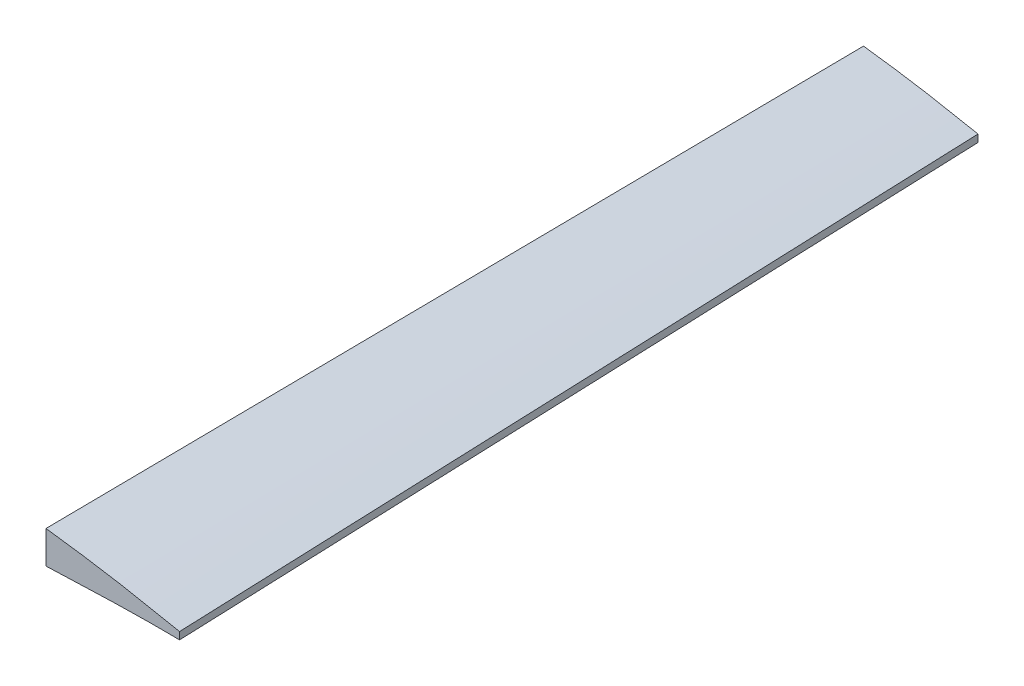
ISO-10303-21;
HEADER;
FILE_DESCRIPTION(('STEP AP214'),'2;1');
FILE_NAME('part.step','',(''),(''),'','','');
FILE_SCHEMA(('AUTOMOTIVE_DESIGN { 1 0 10303 214 1 1 1 1 }'));
ENDSEC;
DATA;
#1=APPLICATION_CONTEXT('core data for automotive mechanical design processes');
#2=APPLICATION_PROTOCOL_DEFINITION('international standard','automotive_design',2000,#1);
#3=PRODUCT_CONTEXT('',#1,'mechanical');
#4=PRODUCT('Part','Part','',(#3));
#5=PRODUCT_RELATED_PRODUCT_CATEGORY('part','',(#4));
#6=PRODUCT_DEFINITION_FORMATION('','',#4);
#7=PRODUCT_DEFINITION_CONTEXT('part definition',#1,'design');
#8=PRODUCT_DEFINITION('design','',#6,#7);
#9=PRODUCT_DEFINITION_SHAPE('','',#8);
#10=(LENGTH_UNIT() NAMED_UNIT(*) SI_UNIT(.MILLI.,.METRE.));
#11=(NAMED_UNIT(*) PLANE_ANGLE_UNIT() SI_UNIT($,.RADIAN.));
#12=(NAMED_UNIT(*) SI_UNIT($,.STERADIAN.) SOLID_ANGLE_UNIT());
#13=UNCERTAINTY_MEASURE_WITH_UNIT(LENGTH_MEASURE(1.E-05),#10,'distance_accuracy_value','');
#14=(GEOMETRIC_REPRESENTATION_CONTEXT(3) GLOBAL_UNCERTAINTY_ASSIGNED_CONTEXT((#13)) GLOBAL_UNIT_ASSIGNED_CONTEXT((#10,
#11,#12)) REPRESENTATION_CONTEXT('',''));
#15=CARTESIAN_POINT('',(0.,0.,0.));
#16=DIRECTION('',(0.,0.,1.));
#17=DIRECTION('',(1.,0.,0.));
#18=AXIS2_PLACEMENT_3D('',#15,#16,#17);
#19=CARTESIAN_POINT('',(206.514876786188,1.05257573191463,-2.3100066304238E-07));
#20=CARTESIAN_POINT('',(216.343251190793,1.1251743413413,256.666666435666));
#21=CARTESIAN_POINT('',(226.171625595397,1.19777295076798,513.333333102333));
#22=CARTESIAN_POINT('',(236.000000000097,1.27037156019246,769.999999768999));
#23=CARTESIAN_POINT('',(202.804481962751,1.09254132410476,-2.3100066304238E-07));
#24=CARTESIAN_POINT('',(212.221409948395,1.18934993939449,256.666666435666));
#25=CARTESIAN_POINT('',(221.638337934039,1.28615855468421,513.333333102333));
#26=CARTESIAN_POINT('',(231.055265919778,1.38296716997175,769.999999768999));
#27=CARTESIAN_POINT('',(195.383134947981,1.07253183731694,-2.30999996908565E-07));
#28=CARTESIAN_POINT('',(203.977460493296,1.19654646463271,256.666666435667));
#29=CARTESIAN_POINT('',(212.570491423613,1.32056286405642,513.333333102333));
#30=CARTESIAN_POINT('',(221.162228710543,1.44462942653907,769.999999768999));
#31=CARTESIAN_POINT('',(184.254157652275,0.86849812408981,-2.31001662243102E-07));
#32=CARTESIAN_POINT('',(191.617059378691,0.994187581201744,256.666666435665));
#33=CARTESIAN_POINT('',(198.973568943558,1.11988578774656,513.333333102332));
#34=CARTESIAN_POINT('',(206.323691143901,1.24583167639904,769.999999768999));
#35=CARTESIAN_POINT('',(174.982976470324,0.594486062706824,-2.30999219752448E-07));
#36=CARTESIAN_POINT('',(181.321567632077,0.70369207727101,256.666666435667));
#37=CARTESIAN_POINT('',(187.647495840888,0.812915424040713,513.333333102333));
#38=CARTESIAN_POINT('',(193.960770599744,0.922629435234288,769.999999768999));
#39=CARTESIAN_POINT('',(167.567742030175,0.334202302814701,-2.31000552020078E-07));
#40=CARTESIAN_POINT('',(173.087750650317,0.422102598799183,256.666666435666));
#41=CARTESIAN_POINT('',(178.589230093311,0.510028255627987,513.333333102333));
#42=CARTESIAN_POINT('',(184.072194264582,0.598671885235844,769.999999768999));
#43=CARTESIAN_POINT('',(162.006996286038,0.123391465486451,-2.31001218153892E-07));
#44=CARTESIAN_POINT('',(166.913417114104,0.191807162552109,256.666666435666));
#45=CARTESIAN_POINT('',(171.796575328939,0.260254698506445,513.333333102332));
#46=CARTESIAN_POINT('',(176.65648838833,0.329603622916535,769.999999768999));
#47=CARTESIAN_POINT('',(156.446755461143,-0.0980783512672515,-2.31000329975473E-07));
#48=CARTESIAN_POINT('',(160.73986574094,-0.0520112867762257,256.666666435666));
#49=CARTESIAN_POINT('',(165.004737231109,-0.00590557343201956,513.333333102333));
#50=CARTESIAN_POINT('',(169.241391124037,0.0412943516141696,769.999999768999));
#51=CARTESIAN_POINT('',(150.88699630953,-0.329222833712342,-2.30999885886263E-07));
#52=CARTESIAN_POINT('',(154.566904364104,-0.306274590224425,256.666666435667));
#53=CARTESIAN_POINT('',(158.213445739959,-0.283280680643779,513.333333102333));
#54=CARTESIAN_POINT('',(161.826645478013,-0.258993855386183,769.999999768999));
#55=CARTESIAN_POINT('',(145.327695585237,-0.569057668114758,-2.31001662243102E-07));
#56=CARTESIAN_POINT('',(148.39446024089,-0.570773552782622,256.666666435665));
#57=CARTESIAN_POINT('',(151.422669643654,-0.572436671488259,513.333333102332));
#58=CARTESIAN_POINT('',(154.412352728614,-0.572605816654033,769.999999768999));
#59=CARTESIAN_POINT('',(139.768794581636,-0.816855106556249,-2.30999996908565E-07));
#60=CARTESIAN_POINT('',(142.222399716611,-0.84465144275021,256.666666435667));
#61=CARTESIAN_POINT('',(144.632291367069,-0.872387955127603,513.333333102333));
#62=CARTESIAN_POINT('',(146.998502339591,-0.898430609055059,769.999999768999));
#63=CARTESIAN_POINT('',(134.210088681083,-1.0676577609188,-2.30999996908565E-07));
#64=CARTESIAN_POINT('',(136.050431102732,-1.12289266022508,256.666666435667));
#65=CARTESIAN_POINT('',(137.84202317839,-1.17806084452071,513.333333102333));
#66=CARTESIAN_POINT('',(139.584901495171,-1.23133998524996,769.999999768999));
#67=CARTESIAN_POINT('',(128.651485276052,-1.31999933603527,-2.31001773265405E-07));
#68=CARTESIAN_POINT('',(129.87834802577,-1.40318783822783,256.666666435665));
#69=CARTESIAN_POINT('',(131.051635965796,-1.48630302552102,513.333333102332));
#70=CARTESIAN_POINT('',(132.17138930451,-1.5673422107658,769.999999768999));
#71=CARTESIAN_POINT('',(123.092859088806,-1.5712163835515,-2.30999441797053E-07));
#72=CARTESIAN_POINT('',(123.705936377013,-1.68275293776701,256.666666435667));
#73=CARTESIAN_POINT('',(124.260917817217,-1.79420999314487,513.333333102333));
#74=CARTESIAN_POINT('',(124.757847011495,-1.9034158414675,769.999999768999));
#75=CARTESIAN_POINT('',(117.534098150105,-1.81919588150206,-2.31000996109287E-07));
#76=CARTESIAN_POINT('',(117.532988428087,-1.95912819408005,256.666666435666));
#77=CARTESIAN_POINT('',(117.469656272762,-2.09897536447769,513.333333102333));
#78=CARTESIAN_POINT('',(117.344148384037,-2.23641140312929,769.999999768999));
#79=CARTESIAN_POINT('',(111.975075464223,-2.06122605114337,-2.31001218153892E-07));
#80=CARTESIAN_POINT('',(111.359279231014,-2.22925512540945,256.666666435666));
#81=CARTESIAN_POINT('',(110.677619459819,-2.39719407939314,513.333333102333));
#82=CARTESIAN_POINT('',(109.930145584208,-2.56258078409675,769.999999768999));
#83=CARTESIAN_POINT('',(106.415777304108,-2.29715151527564,-2.3100021895317E-07));
#84=CARTESIAN_POINT('',(105.184689147157,-2.49239025256732,256.666666435666));
#85=CARTESIAN_POINT('',(103.884672855781,-2.68753468136032,513.333333102333));
#86=CARTESIAN_POINT('',(102.515780164745,-2.88000807733678,769.999999769));
#87=CARTESIAN_POINT('',(100.856199856608,-2.52700994825923,-2.31000440997775E-07));
#88=CARTESIAN_POINT('',(99.0091460431719,-2.74885274002393,256.666666435666));
#89=CARTESIAN_POINT('',(97.0907670347287,-2.97059794960454,513.333333102333));
#90=CARTESIAN_POINT('',(95.1011163664716,-3.1895792036705,769.999999769));
#91=CARTESIAN_POINT('',(95.2962168866286,-2.7478574376538,-2.3099977486396E-07));
#92=CARTESIAN_POINT('',(92.8324437767108,-2.99572222752651,256.666666435667));
#93=CARTESIAN_POINT('',(90.2957069746805,-3.24348720070567,513.333333102333));
#94=CARTESIAN_POINT('',(87.6860612470888,-3.48842468335125,769.999999769));
#95=CARTESIAN_POINT('',(89.7357134123393,-2.9565425524189,-2.31001440198497E-07));
#96=CARTESIAN_POINT('',(86.6543620412383,-3.22925274347201,256.666666435665));
#97=CARTESIAN_POINT('',(83.4992580720108,-3.50186204714318,513.333333102333));
#98=CARTESIAN_POINT('',(80.2704568651979,-3.77161323978176,769.999999769));
#99=CARTESIAN_POINT('',(84.174680147662,-3.1524455232185,-2.30999219752448E-07));
#100=CARTESIAN_POINT('',(80.4747986804392,-3.44840700041787,256.666666435667));
#101=CARTESIAN_POINT('',(76.7013163277849,-3.7442678080131,513.333333102333));
#102=CARTESIAN_POINT('',(72.8542883385613,-4.03727632543746,769.999999769));
#103=CARTESIAN_POINT('',(79.5399942376575,-3.303076802693,-2.31001329176195E-07));
#104=CARTESIAN_POINT('',(75.3238187318821,-3.61728698062098,256.666666435666));
#105=CARTESIAN_POINT('',(71.0350284731926,-3.93139784801904,513.333333102333));
#106=CARTESIAN_POINT('',(66.6736779724114,-4.24269458279894,769.999999769));
#107=CARTESIAN_POINT('',(75.8318955192106,-3.41375608768484,-2.3099977486396E-07));
#108=CARTESIAN_POINT('',(71.2021222311206,-3.74148897401257,256.666666435667));
#109=CARTESIAN_POINT('',(66.5010844331021,-4.06912440594793,513.333333102333));
#110=CARTESIAN_POINT('',(61.7288356244107,-4.39399797882846,769.999999769));
#111=CARTESIAN_POINT('',(73.0506286890622,-3.49084690607741,-2.3099933077475E-07));
#112=CARTESIAN_POINT('',(68.1103688563377,-3.82829125393365,256.666666435667));
#113=CARTESIAN_POINT('',(63.1001492428615,-4.1656399395204,513.333333102333));
#114=CARTESIAN_POINT('',(58.0200223701099,-4.50027728584049,769.999999769));
#115=CARTESIAN_POINT('',(70.2691512715089,-3.56101330306126,-2.3100199531001E-07));
#116=CARTESIAN_POINT('',(65.018099942492,-3.90746736951101,256.666666435665));
#117=CARTESIAN_POINT('',(59.6986969872903,-4.25382798141453,513.333333102332));
#118=CARTESIAN_POINT('',(54.310993721958,-4.59753952931034,769.999999769));
#119=CARTESIAN_POINT('',(67.4874365133195,-3.62232595151462,-2.3099933077475E-07));
#120=CARTESIAN_POINT('',(61.9252776029895,-3.97702014125699,256.666666435667));
#121=CARTESIAN_POINT('',(56.2966900248839,-4.33162351535742,513.333333102333));
#122=CARTESIAN_POINT('',(50.6017236534547,-4.68365229703493,769.999999769));
#123=CARTESIAN_POINT('',(64.7054897549405,-3.67362030294981,-2.31001773265405E-07));
#124=CARTESIAN_POINT('',(58.8318927443724,-4.03551008590313,256.666666435665));
#125=CARTESIAN_POINT('',(52.8941162067319,-4.39731213888042,513.333333102333));
#126=CARTESIAN_POINT('',(46.8922083301516,-4.75662670820058,769.999999769));
#127=CARTESIAN_POINT('',(61.9233151775352,-3.71296591422011,-2.30999108730146E-07));
#128=CARTESIAN_POINT('',(55.7379400245714,-4.08087414780738,256.666666435667));
#129=CARTESIAN_POINT('',(49.490972045985,-4.4486981994268,513.333333102333));
#130=CARTESIAN_POINT('',(43.182457490334,-4.81413495419095,769.999999769));
#131=CARTESIAN_POINT('',(59.1409487390408,-3.73864825878366,-2.31002217354614E-07));
#132=CARTESIAN_POINT('',(52.6434452611672,-4.1110926093989,256.666666435665));
#133=CARTESIAN_POINT('',(46.087284598319,-4.48345680397741,513.333333102332));
#134=CARTESIAN_POINT('',(39.4725107976875,-4.85354740739369,769.999999769));
#135=CARTESIAN_POINT('',(56.3584441280496,-3.74885893146079,-2.30998220551726E-07));
#136=CARTESIAN_POINT('',(49.5484573982834,-4.12421799420391,256.666666435668));
#137=CARTESIAN_POINT('',(42.6831094418415,-4.49950142034496,513.333333102334));
#138=CARTESIAN_POINT('',(35.7624418342181,-4.87263892076307,769.999999769));
#139=CARTESIAN_POINT('',(53.575895407379,-3.7400490915965,-2.31001440198497E-07));
#140=CARTESIAN_POINT('',(46.453067288452,-4.11639630384297,256.666666435665));
#141=CARTESIAN_POINT('',(39.2785455972507,-4.49267290800625,513.333333102333));
#142=CARTESIAN_POINT('',(32.0523691587051,-4.86694565248724,769.999999769));
#143=CARTESIAN_POINT('',(51.2571953950494,-3.71475518641344,-2.31001329176195E-07));
#144=CARTESIAN_POINT('',(43.8733704329223,-4.08987278446708,256.666666435666));
#145=CARTESIAN_POINT('',(36.4412275059845,-4.46492440209059,513.333333102333));
#146=CARTESIAN_POINT('',(28.9608029075247,-4.83810291627942,769.999999769));
#147=CARTESIAN_POINT('',(49.4024244077473,-3.6806992006952,-2.30999996908565E-07));
#148=CARTESIAN_POINT('',(41.809630465492,-4.05358769298537,256.666666435667));
#149=CARTESIAN_POINT('',(34.1714162709004,-4.42641417709061,513.333333102333));
#150=CARTESIAN_POINT('',(26.487815943977,-4.79747980391504,769.999999769));
#151=CARTESIAN_POINT('',(48.0115153121828,-3.64697176329227,-2.30999663841658E-07));
#152=CARTESIAN_POINT('',(40.2619116454592,-4.01729155229722,256.666666435667));
#153=CARTESIAN_POINT('',(32.4691610463133,-4.38755244931011,513.333333102333));
#154=CARTESIAN_POINT('',(24.6332959297336,-4.75614054934235,769.999999769));
#155=CARTESIAN_POINT('',(46.6208499951613,-3.60378386044672,-2.31000774064682E-07));
#156=CARTESIAN_POINT('',(38.7143621609358,-3.97061893143299,256.666666435666));
#157=CARTESIAN_POINT('',(30.767102172067,-4.33739836557655,513.333333102333));
#158=CARTESIAN_POINT('',(22.779100662407,-4.70259699383133,769.999999769));
#159=CARTESIAN_POINT('',(45.2305363651236,-3.5502422074795,-2.31001218153892E-07));
#160=CARTESIAN_POINT('',(37.1670978408447,-3.9124124100385,256.666666435666));
#161=CARTESIAN_POINT('',(29.0653648198724,-4.27453037180827,513.333333102333));
#162=CARTESIAN_POINT('',(20.925366077736,-4.63516350467965,769.999999769));
#163=CARTESIAN_POINT('',(43.84071147985,-3.48495103438891,-2.30998664640936E-07));
#164=CARTESIAN_POINT('',(35.6202699431449,-3.84119159063938,256.666666435667));
#165=CARTESIAN_POINT('',(27.3641158701743,-4.19738344500579,513.333333102334));
#166=CARTESIAN_POINT('',(19.0722760998897,-4.55219048846964,769.999999769));
#167=CARTESIAN_POINT('',(42.4515148080993,-3.40716911639927,-2.31002661443824E-07));
#168=CARTESIAN_POINT('',(34.0740337596473,-3.75603428286178,256.666666435665));
#169=CARTESIAN_POINT('',(25.6635278601421,-4.10485443114466,513.333333102332));
#170=CARTESIAN_POINT('',(17.2200219326358,-4.45239388263314,769.999999769));
#171=CARTESIAN_POINT('',(41.0631746936945,-3.31520638112166,-2.30997554417911E-07));
#172=CARTESIAN_POINT('',(32.5286392638865,-3.65510246661444,256.666666435668));
#173=CARTESIAN_POINT('',(23.9638738153284,-3.99495736437886,513.333333102334));
#174=CARTESIAN_POINT('',(15.3689010747843,-4.33363983067627,769.999999769));
#175=CARTESIAN_POINT('',(39.6758230900145,-3.20915340684075,-2.31003438599942E-07));
#176=CARTESIAN_POINT('',(30.9842417459987,-3.5383846509721,256.666666435664));
#177=CARTESIAN_POINT('',(22.2653337849333,-3.86757868652081,513.333333102332));
#178=CARTESIAN_POINT('',(13.5191197558381,-4.19571276225597,769.999999769));
#179=CARTESIAN_POINT('',(38.5211010616514,-3.10355380931283,-2.30997665440213E-07));
#180=CARTESIAN_POINT('',(29.698662977552,-3.42249225663353,256.666666435668));
#181=CARTESIAN_POINT('',(20.8514094375734,-3.74139693686134,513.333333102334));
#182=CARTESIAN_POINT('',(11.9793591071791,-4.05933893484766,769.999999769));
#183=CARTESIAN_POINT('',(37.598954108119,-3.00289652091325,-2.31002661443824E-07));
#184=CARTESIAN_POINT('',(28.6719255205428,-3.31191924541847,256.666666435665));
#185=CARTESIAN_POINT('',(19.7221461130287,-3.62091103231738,513.333333102332));
#186=CARTESIAN_POINT('',(10.7496330024004,-3.92902011730239,769.999999769));
#187=CARTESIAN_POINT('',(36.90840163473,-2.91831564527825,-2.30998220551726E-07));
#188=CARTESIAN_POINT('',(27.9030055882691,-3.21893131831179,256.666666435668));
#189=CARTESIAN_POINT('',(18.8764352301172,-3.51951821424481,513.333333102334));
#190=CARTESIAN_POINT('',(9.82870649458707,-3.81928347953296,769.999999769));
#191=CARTESIAN_POINT('',(36.2191964256859,-2.82324789728635,-2.31002661443824E-07));
#192=CARTESIAN_POINT('',(27.1355379033646,-3.11430799476221,256.666666435665));
#193=CARTESIAN_POINT('',(18.0323097866786,-3.40534151427764,513.333333102332));
#194=CARTESIAN_POINT('',(8.90952680626503,-3.6956155673289,769.999999769));
#195=CARTESIAN_POINT('',(35.5317065788624,-2.71648992849033,-2.30998664640936E-07));
#196=CARTESIAN_POINT('',(26.369942581055,-2.99663488823784,256.666666435667));
#197=CARTESIAN_POINT('',(17.1902420930766,-3.27675550804274,513.333333102334));
#198=CARTESIAN_POINT('',(7.9926186205913,-3.55617992536424,769.999999769));
#199=CARTESIAN_POINT('',(34.8460884229218,-2.59827004139376,-2.31001440198497E-07));
#200=CARTESIAN_POINT('',(25.606412649928,-2.86604923245899,256.666666435666));
#201=CARTESIAN_POINT('',(16.3504620556127,-3.13380636072061,513.333333102333));
#202=CARTESIAN_POINT('',(7.07824889923575,-3.40093165716801,769.999999769));
#203=CARTESIAN_POINT('',(34.1624614989767,-2.46906385410095,-2.31000329975473E-07));
#204=CARTESIAN_POINT('',(24.8450884708389,-2.72309721658097,256.666666435666));
#205=CARTESIAN_POINT('',(15.5131310326734,-2.97711083276103,513.333333102333));
#206=CARTESIAN_POINT('',(6.16660017577096,-3.23055810137282,769.999999769));
#207=CARTESIAN_POINT('',(33.4809348764171,-2.32912134586175,-2.30999663841658E-07));
#208=CARTESIAN_POINT('',(24.0860752431941,-2.56813106039273,256.666666435667));
#209=CARTESIAN_POINT('',(14.6783505314696,-2.80712338473547,513.333333102333));
#210=CARTESIAN_POINT('',(5.25777044286745,-3.04561596622102,769.999999769));
#211=CARTESIAN_POINT('',(32.8016801982673,-2.17866077658321,-2.31000996109287E-07));
#212=CARTESIAN_POINT('',(23.3296096122695,-2.40123491743431,256.666666435666));
#213=CARTESIAN_POINT('',(13.8464223773172,-2.62379406406041,513.333333102333));
#214=CARTESIAN_POINT('',(4.35212688353599,-2.8459211998939,769.999999769));
#215=CARTESIAN_POINT('',(32.1247055646812,-2.01784370975901,-2.3099977486396E-07));
#216=CARTESIAN_POINT('',(22.5755808731501,-2.22309439941765,256.666666435667));
#217=CARTESIAN_POINT('',(13.0171172380207,-2.42833253090952,513.333333102333));
#218=CARTESIAN_POINT('',(3.44932171595533,-2.63320751791521,769.999999769));
#219=CARTESIAN_POINT('',(31.4580693156718,-1.81684237701649,-2.31000774064682E-07));
#220=CARTESIAN_POINT('',(21.8328950764084,-2.00061301085735,256.666666435666));
#221=CARTESIAN_POINT('',(12.2001890525002,-2.18437356292809,513.333333102333));
#222=CARTESIAN_POINT('',(2.55995694504846,-2.36784097794931,769.999999769));
#223=CARTESIAN_POINT('',(30.9215965965164,-1.59425976753013,-2.30999663841658E-07));
#224=CARTESIAN_POINT('',(21.2352536833344,-1.75344027182747,256.666666435667));
#225=CARTESIAN_POINT('',(11.5429096441237,-1.9126127918368,513.333333102333));
#226=CARTESIAN_POINT('',(1.84456903182479,-2.07155147100929,769.999999769));
#227=CARTESIAN_POINT('',(30.5116793297101,-1.37676139847354,-2.31000996109287E-07));
#228=CARTESIAN_POINT('',(20.7788045111028,-1.51145533182978,256.666666435666));
#229=CARTESIAN_POINT('',(11.0411679979467,-1.64614297929633,513.333333102333));
#230=CARTESIAN_POINT('',(1.29877341347121,-1.78064480034968,769.999999769));
#231=CARTESIAN_POINT('',(30.215627219337,-1.19352282443832,-2.30999441797053E-07));
#232=CARTESIAN_POINT('',(20.4492112260913,-1.30731286190051,256.666666435667));
#233=CARTESIAN_POINT('',(10.6789705864239,-1.42109789750854,513.333333102333));
#234=CARTESIAN_POINT('',(0.904908220672712,-1.53473340710885,769.999999769));
#235=CARTESIAN_POINT('',(29.9409476179756,-0.978898927483217,-2.31001329176195E-07));
#236=CARTESIAN_POINT('',(20.1442561597694,-1.06754354468344,256.666666435666));
#237=CARTESIAN_POINT('',(10.3446846000092,-1.1561844543322,513.333333102333));
#238=CARTESIAN_POINT('',(0.542235150516891,-1.24471242882758,769.999999769));
#239=CARTESIAN_POINT('',(29.7031715366915,-0.722631684582861,-2.3099933077475E-07));
#240=CARTESIAN_POINT('',(19.8811990929132,-0.780515207491566,256.666666435667));
#241=CARTESIAN_POINT('',(10.0572986114124,-0.838396327449146,513.333333102333));
#242=CARTESIAN_POINT('',(0.231471589854297,-0.896201394417529,769.999999769));
#243=CARTESIAN_POINT('',(29.5415308507127,-0.408663051412548,-2.3100110713159E-07));
#244=CARTESIAN_POINT('',(19.7072375144956,-0.428390992568505,256.666666435666));
#245=CARTESIAN_POINT('',(9.87197574557555,-0.448117845701718,513.333333102333));
#246=CARTESIAN_POINT('',(0.0357463218024,-0.467805820180843,769.999999769));
#247=CARTESIAN_POINT('',(29.5148767858233,-0.175069322680377,-2.31000329975473E-07));
#248=CARTESIAN_POINT('',(19.6818962972766,-0.168463211803544,256.666666435666));
#249=CARTESIAN_POINT('',(9.84859215498068,-0.161856896428543,513.333333102333));
#250=CARTESIAN_POINT('',(0.0149646531256292,-0.155236680644167,769.999999769));
#251=CARTESIAN_POINT('',(29.51487678753,0.178596613810719,-2.31000329975473E-07));
#252=CARTESIAN_POINT('',(19.6868354677178,0.224355997823146,256.666666435666));
#253=CARTESIAN_POINT('',(9.85945763570344,0.270114233680999,513.333333102333));
#254=CARTESIAN_POINT('',(0.0327428452048559,0.315848128821946,769.999999769));
#255=CARTESIAN_POINT('',(29.6231551927125,0.64743838401604,-2.31000996109287E-07));
#256=CARTESIAN_POINT('',(19.8108876458472,0.743628695555428,256.666666435666));
#257=CARTESIAN_POINT('',(10.0006001953789,0.839816054835215,513.333333102333));
#258=CARTESIAN_POINT('',(0.192291407412301,0.935928068922718,769.999999769));
#259=CARTESIAN_POINT('',(29.8907307334201,1.30771182083638,-2.30999441797053E-07));
#260=CARTESIAN_POINT('',(20.1099607392645,1.47586437203251,256.666666435667));
#261=CARTESIAN_POINT('',(10.3331148356464,1.64401130720032,513.333333102333));
#262=CARTESIAN_POINT('',(0.560190130438716,1.81200758810863,769.999999769));
#263=CARTESIAN_POINT('',(30.2350137960078,1.93484832516219,-2.31001218153892E-07));
#264=CARTESIAN_POINT('',(20.4957487215915,2.16961590785893,256.666666435666));
#265=CARTESIAN_POINT('',(10.7623209953274,2.40437525289759,513.333333102333));
#266=CARTESIAN_POINT('',(1.03472628990812,2.63890982519682,769.999999769));
#267=CARTESIAN_POINT('',(30.6473205303253,2.51720760178546,-2.30999441797053E-07));
#268=CARTESIAN_POINT('',(20.955817258361,2.81380160305857,256.666666435667));
#269=CARTESIAN_POINT('',(11.2720340378701,3.11038478693291,513.333333102333));
#270=CARTESIAN_POINT('',(1.59596512927976,3.40667026311658,769.999999769));
#271=CARTESIAN_POINT('',(31.1028774323994,3.06660980830922,-2.31000440997775E-07));
#272=CARTESIAN_POINT('',(21.4633210964701,3.4214725735881,256.666666435666));
#273=CARTESIAN_POINT('',(11.8333371432743,3.7763219833667,513.333333102333));
#274=CARTESIAN_POINT('',(2.2129184437519,4.13080192697354,769.999999769));
#275=CARTESIAN_POINT('',(31.593039217393,3.58498058121649,-2.31001773265405E-07));
#276=CARTESIAN_POINT('',(22.0090496303063,3.99451300724529,256.666666435665));
#277=CARTESIAN_POINT('',(12.4364545673846,4.40402958106163,513.333333102333));
#278=CARTESIAN_POINT('',(2.87524553272163,4.81310609963668,769.999999769));
#279=CARTESIAN_POINT('',(32.1109146711742,4.07562093973751,-2.30998775663238E-07));
#280=CARTESIAN_POINT('',(22.5852717896261,4.53675383431731,256.666666435667));
#281=CARTESIAN_POINT('',(13.072815566078,4.99786842111187,513.333333102334));
#282=CARTESIAN_POINT('',(3.57353616028251,5.45847352594862,769.999999769));
#283=CARTESIAN_POINT('',(32.8311878398368,4.6967435757419,-2.31001329176195E-07));
#284=CARTESIAN_POINT('',(23.3862335475323,5.22318701099145,256.666666435666));
#285=CARTESIAN_POINT('',(13.9568156578562,5.74960891887818,513.333333102333));
#286=CARTESIAN_POINT('',(4.54292256792982,6.27543031624427,769.999999769));
#287=CARTESIAN_POINT('',(33.7774300140624,5.41743591219347,-2.31000107930868E-07));
#288=CARTESIAN_POINT('',(24.4382611654445,6.0189881150675,256.666666435667));
#289=CARTESIAN_POINT('',(15.1174917924112,6.62051486770589,513.333333102333));
#290=CARTESIAN_POINT('',(5.81510814437395,7.22133019470975,769.999999769));
#291=CARTESIAN_POINT('',(34.9671106732925,6.20521091684949,-2.31000774064682E-07));
#292=CARTESIAN_POINT('',(25.7599805569367,6.8890515854791,256.666666435666));
#293=CARTESIAN_POINT('',(16.5745684890457,7.57286225698536,513.333333102333));
#294=CARTESIAN_POINT('',(7.41085822961101,8.25583294119525,769.999999769));
#295=CARTESIAN_POINT('',(36.1924425545112,6.93590950792894,-2.30999552819355E-07));
#296=CARTESIAN_POINT('',(27.1208930356446,7.6960267262248,256.666666435667));
#297=CARTESIAN_POINT('',(18.0742644813141,8.45610955907025,513.333333102333));
#298=CARTESIAN_POINT('',(9.05253824883115,9.21522832296374,769.999999769));
#299=CARTESIAN_POINT('',(37.4471098997516,7.61496904628498,-2.31000996109287E-07));
#300=CARTESIAN_POINT('',(28.5142434060679,8.44561545394146,256.666666435666));
#301=CARTESIAN_POINT('',(19.6093865940424,9.27622324438208,513.333333102333));
#302=CARTESIAN_POINT('',(10.7325185039517,10.1057473077528,769.999999769));
#303=CARTESIAN_POINT('',(38.724821571903,8.2492749533289,-2.31000329975473E-07));
#304=CARTESIAN_POINT('',(29.9331215753093,9.14543787568677,256.666666435667));
#305=CARTESIAN_POINT('',(21.1724072364051,10.0415581036259,513.333333102333));
#306=CARTESIAN_POINT('',(12.4426553629851,10.9364793134464,769.999999769));
#307=CARTESIAN_POINT('',(40.4544964118661,9.04067761991832,-2.30998886685541E-07));
#308=CARTESIAN_POINT('',(31.8536416918513,10.0184098203331,256.666666435667));
#309=CARTESIAN_POINT('',(23.2875922199253,10.9960940934768,513.333333102334));
#310=CARTESIAN_POINT('',(14.7563219385195,11.9724313745708,769.999999769));
#311=CARTESIAN_POINT('',(42.6567014336479,9.93804549592608,-2.31001662243102E-07));
#312=CARTESIAN_POINT('',(34.2987485503995,11.007550932655,256.666666435666));
#313=CARTESIAN_POINT('',(25.9801008398072,12.0770022774586,513.333333102333));
#314=CARTESIAN_POINT('',(17.7007288685131,13.1449322981287,769.999999769));
#315=CARTESIAN_POINT('',(45.3451855235363,10.8941447531945,-2.30999552819355E-07));
#316=CARTESIAN_POINT('',(37.2835991618509,12.060621931664,256.666666435667));
#317=CARTESIAN_POINT('',(29.2662902436824,13.2270382068889,513.333333102333));
#318=CARTESIAN_POINT('',(21.2932256054444,14.3917405242591,769.999999769));
#319=CARTESIAN_POINT('',(48.0698173233421,11.7416538284923,-2.31000774064682E-07));
#320=CARTESIAN_POINT('',(40.3087665672497,12.9924463434035,256.666666435666));
#321=CARTESIAN_POINT('',(32.5965495497869,14.2431717140242,513.333333102333));
#322=CARTESIAN_POINT('',(24.9331296891105,15.4920066060999,769.999999769));
#323=CARTESIAN_POINT('',(50.8229623323552,12.4906758972436,-2.30999996908565E-07));
#324=CARTESIAN_POINT('',(43.3655279202115,13.8152209627076,256.666666435667));
#325=CARTESIAN_POINT('',(35.9610792289331,15.1396931971168,513.333333102333));
#326=CARTESIAN_POINT('',(28.6095765616459,16.4621140935728,769.999999769));
#327=CARTESIAN_POINT('',(53.5979212954047,13.1547477511295,-2.31000329975473E-07));
#328=CARTESIAN_POINT('',(46.4464578311334,14.5438402405722,256.666666435666));
#329=CARTESIAN_POINT('',(39.3517394199574,15.9328547504846,513.333333102333));
#330=CARTESIAN_POINT('',(32.3137235444519,17.3196722725693,769.999999769));
#331=CARTESIAN_POINT('',(56.3893137434759,13.7447623889791,-2.3100066304238E-07));
#332=CARTESIAN_POINT('',(49.5457075285082,15.1908058098972,256.666666435666));
#333=CARTESIAN_POINT('',(42.7622247117322,16.6367666251067,513.333333102333));
#334=CARTESIAN_POINT('',(36.0388202409053,18.0803995603988,769.999999769));
#335=CARTESIAN_POINT('',(60.1287482687962,14.4442739680206,-2.31000885086985E-07));
#336=CARTESIAN_POINT('',(53.6975896536273,15.9568484083654,256.666666435666));
#337=CARTESIAN_POINT('',(47.3305664644284,17.4693347498361,513.333333102333));
#338=CARTESIAN_POINT('',(41.0276306385165,18.9793377633189,769.999999769));
#339=CARTESIAN_POINT('',(64.8278749424875,15.1769017140717,-2.3100066304238E-07));
#340=CARTESIAN_POINT('',(58.9154569281848,16.7572494256701,256.666666435666));
#341=CARTESIAN_POINT('',(53.0712952210972,18.3375033977185,513.333333102333));
#342=CARTESIAN_POINT('',(47.2953386660941,19.9151143674104,769.999999769));
#343=CARTESIAN_POINT('',(70.4949266087286,15.8511075671207,-2.3099933077475E-07));
#344=CARTESIAN_POINT('',(65.2088027346214,17.4891335245207,256.666666435667));
#345=CARTESIAN_POINT('',(59.9945428826307,19.1270608068712,513.333333102333));
#346=CARTESIAN_POINT('',(54.8520931896839,20.762205280786,769.999999769));
#347=CARTESIAN_POINT('',(76.1800466044807,16.3487103634681,-2.31002217354614E-07));
#348=CARTESIAN_POINT('',(71.5227088139482,18.0264229660939,256.666666435665));
#349=CARTESIAN_POINT('',(66.9395987208124,19.7040336635435,513.333333102332));
#350=CARTESIAN_POINT('',(62.4306606870846,21.378769935653,769.999999769));
#351=CARTESIAN_POINT('',(81.876044729268,16.6992627066688,-2.30998886685541E-07));
#352=CARTESIAN_POINT('',(77.8493560296849,18.4008296252452,256.666666435667));
#353=CARTESIAN_POINT('',(73.898107966129,20.1022929859541,513.333333102333));
#354=CARTESIAN_POINT('',(70.0222439887521,21.8008348796047,769.999999769));
#355=CARTESIAN_POINT('',(87.5785224664683,16.9206590528957,-2.31000996109287E-07));
#356=CARTESIAN_POINT('',(84.1838312792741,18.6321035946166,256.666666435666));
#357=CARTESIAN_POINT('',(80.8647362330599,20.3434443752761,513.333333102333));
#358=CARTESIAN_POINT('',(77.6211806592043,22.0518576083564,769.999999769));
#359=CARTESIAN_POINT('',(93.2843360010007,17.0266354578784,-2.31000552020078E-07));
#360=CARTESIAN_POINT('',(90.5226111395829,18.7358441196367,256.666666435666));
#361=CARTESIAN_POINT('',(87.8356737933913,20.4449501386986,513.333333102333));
#362=CARTESIAN_POINT('',(85.2234678981492,22.1511598768697,769.999999769));
#363=CARTESIAN_POINT('',(98.9910513400316,17.0304747699849,-2.3099977486396E-07));
#364=CARTESIAN_POINT('',(96.8629874870466,18.7260072305253,256.666666435667));
#365=CARTESIAN_POINT('',(94.8080316957991,20.4214393603557,513.333333102333));
#366=CARTESIAN_POINT('',(92.8261291595055,22.1140402092041,769.999999769));
#367=CARTESIAN_POINT('',(106.599225790441,16.9108791189279,-2.3099933077475E-07));
#368=CARTESIAN_POINT('',(105.316629644976,18.5754095111162,256.666666435667));
#369=CARTESIAN_POINT('',(104.103865590247,20.2398440761541,513.333333102333));
#370=CARTESIAN_POINT('',(102.960881273698,21.901574185731,769.999999769));
#371=CARTESIAN_POINT('',(116.104266836085,16.5490470353005,-2.31002550421522E-07));
#372=CARTESIAN_POINT('',(115.879110183441,18.1509902315463,256.666666435665));
#373=CARTESIAN_POINT('',(115.717980103301,19.7528455744543,513.333333102332));
#374=CARTESIAN_POINT('',(115.620828593918,21.3522212569108,769.999999768999));
#375=CARTESIAN_POINT('',(127.495306633652,15.8237510960973,-2.30999663841658E-07));
#376=CARTESIAN_POINT('',(128.538789934946,17.3197308589483,256.666666435667));
#377=CARTESIAN_POINT('',(129.637342723471,18.8156350645133,513.333333102333));
#378=CARTESIAN_POINT('',(130.790923711534,20.3094064727038,769.999999768999));
#379=CARTESIAN_POINT('',(138.866906097349,14.843183731888,-2.3099977486396E-07));
#380=CARTESIAN_POINT('',(141.177593941125,16.2042955024689,256.666666435667));
#381=CARTESIAN_POINT('',(143.533150147238,17.5653457157886,513.333333102333));
#382=CARTESIAN_POINT('',(145.933541075375,18.9246581919676,769.999999768999));
#383=CARTESIAN_POINT('',(150.215946551245,13.631664237032,-2.3100199531001E-07));
#384=CARTESIAN_POINT('',(153.791566109829,14.8331535973007,256.666666435665));
#385=CARTESIAN_POINT('',(157.401355290007,16.0345960808018,513.333333102332));
#386=CARTESIAN_POINT('',(161.045288472419,17.2347151726446,769.999999768999));
#387=CARTESIAN_POINT('',(161.540255223159,12.2107071834343,-2.30998997707843E-07));
#388=CARTESIAN_POINT('',(166.377420757237,13.2277588420639,256.666666435667));
#389=CARTESIAN_POINT('',(171.238305980093,14.2447779613845,513.333333102333));
#390=CARTESIAN_POINT('',(176.122893107131,15.2608784078695,769.999999768999));
#391=CARTESIAN_POINT('',(172.836478705264,10.583890693875,-2.310015512208E-07));
#392=CARTESIAN_POINT('',(178.930669019057,11.3918757470241,256.666666435665));
#393=CARTESIAN_POINT('',(185.039124320507,12.1998412317833,513.333333102332));
#394=CARTESIAN_POINT('',(191.161833913848,13.0072542239616,769.999999768999));
#395=CARTESIAN_POINT('',(184.100420631093,8.75018682744348,-2.31000774064682E-07));
#396=CARTESIAN_POINT('',(191.445627987776,9.32253460499319,256.666666435666));
#397=CARTESIAN_POINT('',(198.797387286463,9.89487339502918,513.333333102333));
#398=CARTESIAN_POINT('',(206.155693614525,10.4669584222627,769.999999768999));
#399=CARTESIAN_POINT('',(195.327442880973,6.70564053626499,-2.31000440997775E-07));
#400=CARTESIAN_POINT('',(203.916855418393,7.01842558134876,256.666666435666));
#401=CARTESIAN_POINT('',(212.507594931409,7.33120880624769,513.333333102333));
#402=CARTESIAN_POINT('',(221.099660425075,7.64394063573783,769.999999768999));
#403=CARTESIAN_POINT('',(202.787844030427,5.21889769791556,-2.3100066304238E-07));
#404=CARTESIAN_POINT('',(212.203180937021,5.35111703596595,256.666666435666));
#405=CARTESIAN_POINT('',(221.618517843614,5.48333637401658,513.333333102333));
#406=CARTESIAN_POINT('',(231.033854750248,5.61555571205886,769.999999768999));
#407=CARTESIAN_POINT('',(206.514876786189,4.46080949672058,-2.3100066304238E-07));
#408=CARTESIAN_POINT('',(216.343251190793,4.50588722024582,256.666666435666));
#409=CARTESIAN_POINT('',(226.171625595397,4.55096494377131,513.333333102333));
#410=CARTESIAN_POINT('',(236.000000000041,4.59604266728844,769.999999768999));
#411=B_SPLINE_SURFACE_WITH_KNOTS('',3,3,((#19,#20,#21,#22),(#23,#24,#25,#26),(#27,#28,#29,#30),
(#31,#32,#33,#34),(#35,#36,#37,#38),(#39,#40,#41,#42),(#43,#44,#45,#46),(#47,#48,#49,#50),(#51,
#52,#53,#54),(#55,#56,#57,#58),(#59,#60,#61,#62),(#63,#64,#65,#66),(#67,#68,#69,#70),(#71,#72,
#73,#74),(#75,#76,#77,#78),(#79,#80,#81,#82),(#83,#84,#85,#86),(#87,#88,#89,#90),(#91,#92,#93,
#94),(#95,#96,#97,#98),(#99,#100,#101,#102),(#103,#104,#105,#106),(#107,#108,#109,#110),(#111,
#112,#113,#114),(#115,#116,#117,#118),(#119,#120,#121,#122),(#123,#124,#125,#126),(#127,#128,
#129,#130),(#131,#132,#133,#134),(#135,#136,#137,#138),(#139,#140,#141,#142),(#143,#144,#145,
#146),(#147,#148,#149,#150),(#151,#152,#153,#154),(#155,#156,#157,#158),(#159,#160,#161,#162),
(#163,#164,#165,#166),(#167,#168,#169,#170),(#171,#172,#173,#174),(#175,#176,#177,#178),(#179,
#180,#181,#182),(#183,#184,#185,#186),(#187,#188,#189,#190),(#191,#192,#193,#194),(#195,#196,
#197,#198),(#199,#200,#201,#202),(#203,#204,#205,#206),(#207,#208,#209,#210),(#211,#212,#213,
#214),(#215,#216,#217,#218),(#219,#220,#221,#222),(#223,#224,#225,#226),(#227,#228,#229,#230),
(#231,#232,#233,#234),(#235,#236,#237,#238),(#239,#240,#241,#242),(#243,#244,#245,#246),(#247,
#248,#249,#250),(#251,#252,#253,#254),(#255,#256,#257,#258),(#259,#260,#261,#262),(#263,#264,
#265,#266),(#267,#268,#269,#270),(#271,#272,#273,#274),(#275,#276,#277,#278),(#279,#280,#281,
#282),(#283,#284,#285,#286),(#287,#288,#289,#290),(#291,#292,#293,#294),(#295,#296,#297,#298),
(#299,#300,#301,#302),(#303,#304,#305,#306),(#307,#308,#309,#310),(#311,#312,#313,#314),(#315,
#316,#317,#318),(#319,#320,#321,#322),(#323,#324,#325,#326),(#327,#328,#329,#330),(#331,#332,
#333,#334),(#335,#336,#337,#338),(#339,#340,#341,#342),(#343,#344,#345,#346),(#347,#348,#349,
#350),(#351,#352,#353,#354),(#355,#356,#357,#358),(#359,#360,#361,#362),(#363,#364,#365,#366),
(#367,#368,#369,#370),(#371,#372,#373,#374),(#375,#376,#377,#378),(#379,#380,#381,#382),(#383,
#384,#385,#386),(#387,#388,#389,#390),(#391,#392,#393,#394),(#395,#396,#397,#398),(#399,#400,
#401,#402),(#403,#404,#405,#406),(#407,#408,#409,#410)),.UNSPECIFIED.,.F.,.F.,.F.,(4,1,1,1,1,1,
1,1,1,1,1,1,1,1,1,1,1,1,1,1,1,1,1,1,1,1,1,1,1,1,1,1,1,1,1,1,1,1,1,1,1,1,1,1,1,1,1,1,1,1,1,1,1,1,
1,1,2,1,1,1,1,1,1,1,1,1,1,1,1,1,1,1,1,1,1,1,1,1,1,1,1,1,1,1,1,1,1,1,1,1,1,1,1,1,4),(4,4),(0.,
0.0308642537628385,0.061728507525677,0.0925927612885155,0.108024888169935,0.123457015051354,
0.138889141932773,0.154321268814193,0.169753395695612,0.185185522577031,0.20061764945845,
0.21604977633987,0.231481903221289,0.246914030102708,0.262346156984127,0.277778283865547,
0.293210410746966,0.308642537628385,0.324074664509804,0.339506791391224,0.354938918272643,
0.362654981713352,0.370371045154062,0.378087108594771,0.385803172035481,0.393519235476191,
0.401235298916901,0.40895136235761,0.41666742579832,0.424383489239029,0.432099552679739,
0.435957584400094,0.439815616120449,0.443673647840803,0.447531679561158,0.451389711281513,
0.455247743001868,0.459105774722223,0.462963806442577,0.466821838162932,0.46875085402311,
0.470679869883287,0.472608885743465,0.474537901603642,0.476466917463819,0.478395933323997,
0.480324949184174,0.482253965044352,0.484182980904529,0.486111996764706,0.488041012624884,
0.489005520554973,0.489970028485061,0.49093453641515,0.491899044345239,0.492863552275327,
0.493828060205416,0.495805294345239,0.497782528485061,0.499759762624884,0.501736996764706,
0.503714230904529,0.505691465044351,0.507668699184174,0.509645933323997,0.513600401603642,
0.517554869883287,0.521509338162932,0.525463806442578,0.529418274722223,0.533372743001868,
0.541281679561158,0.549190616120449,0.557099552679739,0.565008489239029,0.57291742579832,
0.58082636235761,0.588735298916901,0.604553172035481,0.620371045154062,0.636188918272643,
0.652006791391224,0.667824664509804,0.683642537628385,0.699460410746966,0.715278283865546,
0.746914030102708,0.77854977633987,0.810185522577031,0.841821268814193,0.873457015051354,
0.905092761288516,0.936728507525677,0.968364253762839,1.),(0.,1.),.UNSPECIFIED.);
#412=CARTESIAN_POINT('',(153.414876781791,13.2164019635647,-2.31041075160476E-07));
#413=CARTESIAN_POINT('',(153.7625475558,13.3179447904261,22.704026027567));
#414=CARTESIAN_POINT('',(154.110218327416,13.4195171389602,45.4080521542265));
#415=CARTESIAN_POINT('',(155.848572174197,13.9275241011047,158.928182139078));
#416=CARTESIAN_POINT('',(157.239255215415,14.3343943731221,249.744284048742));
#417=CARTESIAN_POINT('',(158.856429502102,14.808033721922,355.35099691446));
#418=CARTESIAN_POINT('',(159.082920774718,14.8743801891739,370.141609766287));
#419=CARTESIAN_POINT('',(159.309758008555,14.9408393534324,384.95481500635));
#420=CARTESIAN_POINT('',(159.310103970573,14.9409407140081,384.977407445425));
#421=CARTESIAN_POINT('',(159.310449932592,14.9410420746103,384.9999998845));
#422=B_SPLINE_CURVE_WITH_KNOTS('',3,(#412,#413,#414,#415,#416,#417,#418,#419,#420,#421),
.UNSPECIFIED.,.F.,.F.,(4,2,2,2,4),(0.,68.1207453599493,340.603726802935,384.981213867296,
385.048999812767),.UNSPECIFIED.);
#423=CARTESIAN_POINT('',(153.414876786188,13.2164354984394,-1.15500498054644E-07));
#424=VERTEX_POINT('',#423);
#425=CARTESIAN_POINT('',(159.310449932592,14.9410420746103,384.9999998845));
#426=VERTEX_POINT('',#425);
#427=EDGE_CURVE('E11',#424,#426,#422,.T.);
#428=CARTESIAN_POINT('',(221.257438397522,4.52842608202784,384.9999998845));
#429=CARTESIAN_POINT('',(219.62955874486,4.86130299139203,384.9999998845));
#430=CARTESIAN_POINT('',(218.001378093954,5.19275771210641,384.9999998845));
#431=CARTESIAN_POINT('',(214.743920065116,5.85034820411675,384.9999998845));
#432=CARTESIAN_POINT('',(213.114642671746,6.17648389884035,384.9999998845));
#433=CARTESIAN_POINT('',(210.669475589483,6.65985329674326,384.9999998845));
#434=CARTESIAN_POINT('',(209.854165102864,6.82001299346289,384.9999998845));
#435=CARTESIAN_POINT('',(208.223098970551,7.138048073986,384.9999998845));
#436=CARTESIAN_POINT('',(207.407343325075,7.29592345890424,384.9999998845));
#437=CARTESIAN_POINT('',(205.775366363761,7.60922516017947,384.9999998845));
#438=CARTESIAN_POINT('',(204.959145050544,7.76465149017648,384.9999998845));
#439=CARTESIAN_POINT('',(203.326223364565,8.07297445278846,384.9999998845));
#440=CARTESIAN_POINT('',(202.509522990839,8.22587108029469,384.9999998845));
#441=CARTESIAN_POINT('',(200.058651773505,8.68063378039245,384.9999998845));
#442=CARTESIAN_POINT('',(198.423748607583,8.97856541034634,384.9999998845));
#443=CARTESIAN_POINT('',(195.151915206968,9.56308307609601,384.9999998845));
#444=CARTESIAN_POINT('',(193.514984974213,9.84966912272436,384.9999998845));
#445=CARTESIAN_POINT('',(191.058801037811,10.2707243310623,384.9999998845));
#446=CARTESIAN_POINT('',(190.240291714615,10.4095479584021,384.9999998845));
#447=CARTESIAN_POINT('',(188.60279145267,10.6843180127932,384.9999998845));
#448=CARTESIAN_POINT('',(187.78380051479,10.8202644450191,384.9999998845));
#449=CARTESIAN_POINT('',(185.326120268129,11.2237819258063,384.9999998845));
#450=CARTESIAN_POINT('',(183.686721488965,11.4870315077165,384.9999998845));
#451=CARTESIAN_POINT('',(178.765933845738,12.259479149849,384.9999998845));
#452=CARTESIAN_POINT('',(175.481810096231,12.7514007163372,384.9999998845));
#453=CARTESIAN_POINT('',(170.550867501651,13.4551511224509,384.9999998845));
#454=CARTESIAN_POINT('',(168.906458128292,13.6840419480881,384.9999998845));
#455=CARTESIAN_POINT('',(165.616101959372,14.1304886605135,384.9999998845));
#456=CARTESIAN_POINT('',(163.970155170441,14.3480445959443,384.9999998845));
#457=CARTESIAN_POINT('',(161.821453035041,14.6244770582241,384.9999998845));
#458=CARTESIAN_POINT('',(161.319359713198,14.6885324076143,384.9999998845));
#459=CARTESIAN_POINT('',(160.315016441279,14.8155832409167,384.9999998845));
#460=CARTESIAN_POINT('',(159.81276648526,14.8785786778503,384.9999998845));
#461=CARTESIAN_POINT('',(159.310449932592,14.9410420746103,384.9999998845));
#462=B_SPLINE_CURVE_WITH_KNOTS('',3,(#428,#429,#430,#431,#432,#433,#434,#435,#436,#437,#438,
#439,#440,#441,#442,#443,#444,#445,#446,#447,#448,#449,#450,#451,#452,#453,#454,#455,#456,#457,
#458,#459,#460,#461),.UNSPECIFIED.,.F.,.F.,(4,2,2,2,2,2,2,2,2,2,2,2,2,2,2,2,4),(0.,
4.98471148055392,9.96949465746259,12.4621691160872,14.9548423582195,17.4475017124771,
19.9401661000515,24.9256102688186,29.911049677451,32.4016407994598,34.8922274417064,
39.873394525124,49.8352917087574,54.8160528644817,59.7967926439379,61.3152803761844,
62.8338352359845),.UNSPECIFIED.);
#463=CARTESIAN_POINT('',(221.25743839752,4.52842608202784,384.9999998845));
#464=VERTEX_POINT('',#463);
#465=EDGE_CURVE('E85',#464,#426,#462,.T.);
#466=DIRECTION('',(0.0382643239036917,0.000175498871207315,0.99926763718052));
#467=VECTOR('',#466,1.);
#468=CARTESIAN_POINT('',(221.2574383931,4.52842608200755,384.999999768999));
#469=LINE('',#468,#467);
#470=CARTESIAN_POINT('',(206.514876786189,4.46080949672058,-2.3100066304238E-07));
#471=VERTEX_POINT('',#470);
#472=EDGE_CURVE('E92',#471,#464,#469,.T.);
#473=CARTESIAN_POINT('',(206.514876786189,4.46080949672058,-2.3100066304238E-07));
#474=CARTESIAN_POINT('',(204.858608917198,4.79769870907303,-2.3100066304238E-07));
#475=CARTESIAN_POINT('',(200.698085669248,5.63697374558568,-2.3100066304238E-07));
#476=CARTESIAN_POINT('',(193.837510223659,6.97176864382363,-2.3100066304238E-07));
#477=CARTESIAN_POINT('',(185.752566914504,8.44637887596432,-2.3100066304238E-07));
#478=CARTESIAN_POINT('',(177.147793554704,9.89426193173973,-2.31000552020078E-07));
#479=CARTESIAN_POINT('',(168.105981215542,11.2786216222807,-2.31000552020078E-07));
#480=CARTESIAN_POINT('',(158.718962800934,12.574634115405,-2.31000552020078E-07));
#481=CARTESIAN_POINT('',(149.082268780971,13.7529127877016,-2.31000552020078E-07));
#482=CARTESIAN_POINT('',(139.295761880901,14.7919564108433,-2.31000552020078E-07));
#483=CARTESIAN_POINT('',(129.458756480321,15.6615781620902,-2.31000552020078E-07));
#484=CARTESIAN_POINT('',(119.670664042494,16.3387879418304,-2.31000552020078E-07));
#485=CARTESIAN_POINT('',(110.028074993982,16.8041132818719,-2.31000552020078E-07));
#486=CARTESIAN_POINT('',(100.622109138006,17.0383550244473,-2.31000440997775E-07));
#487=CARTESIAN_POINT('',(91.5400080223392,17.0313313537274,-2.31000440997775E-07));
#488=CARTESIAN_POINT('',(82.8641711320665,16.7717363081176,-2.31000440997775E-07));
#489=CARTESIAN_POINT('',(74.670317247867,16.2564676873003,-2.31000440997775E-07));
#490=CARTESIAN_POINT('',(67.023667644156,15.4847749243805,-2.31000440997775E-07));
#491=CARTESIAN_POINT('',(59.9821543787815,14.4513258991848,-2.31000440997775E-07));
#492=CARTESIAN_POINT('',(53.5929817587434,13.2019314505134,-2.31000440997775E-07));
#493=CARTESIAN_POINT('',(47.8984099211298,11.7419931435873,-2.31000440997775E-07));
#494=CARTESIAN_POINT('',(42.9361542444679,10.0880791695827,-2.31000440997775E-07));
#495=CARTESIAN_POINT('',(38.7230729084715,8.31360902912543,-2.31000440997775E-07));
#496=CARTESIAN_POINT('',(35.2789002987751,6.46559765342407,-2.31000329975473E-07));
#497=CARTESIAN_POINT('',(32.6281977229619,4.62389921255376,-2.31000329975473E-07));
#498=CARTESIAN_POINT('',(30.759271090828,2.78465935040513,-2.31000329975473E-07));
#499=CARTESIAN_POINT('',(29.741372991553,1.1678335586541,-2.31000329975473E-07));
#500=CARTESIAN_POINT('',(29.3072927930551,-0.549235558443018,-2.31000329975473E-07));
#501=CARTESIAN_POINT('',(30.8612768517696,-1.69864204286304,-2.31000329975473E-07));
#502=CARTESIAN_POINT('',(33.1018075623976,-2.27520944099458,-2.31000329975473E-07));
#503=CARTESIAN_POINT('',(36.4492611674781,-2.91777391021241,-2.31000440997775E-07));
#504=CARTESIAN_POINT('',(40.808787532264,-3.32636968235196,-2.31000440997775E-07));
#505=CARTESIAN_POINT('',(46.1783989317632,-3.61916374317496,-2.31000440997775E-07));
#506=CARTESIAN_POINT('',(52.5023561925777,-3.75070431037278,-2.31000440997775E-07));
#507=CARTESIAN_POINT('',(59.7238269655957,-3.75126757839864,-2.31000440997775E-07));
#508=CARTESIAN_POINT('',(67.770267865132,-3.63042112227202,-2.31000440997775E-07));
#509=CARTESIAN_POINT('',(76.5562442182319,-3.40154042226962,-2.31000440997775E-07));
#510=CARTESIAN_POINT('',(85.985434267231,-3.09488550340905,-2.31000440997775E-07));
#511=CARTESIAN_POINT('',(95.9480811470653,-2.72722729097338,-2.31000440997775E-07));
#512=CARTESIAN_POINT('',(106.328508594988,-2.30347693184105,-2.31000440997775E-07));
#513=CARTESIAN_POINT('',(117.009791812757,-1.84510672870883,-2.31000552020078E-07));
#514=CARTESIAN_POINT('',(127.87278334167,-1.35588828744713,-2.31000552020078E-07));
#515=CARTESIAN_POINT('',(138.797709464776,-0.858911189213053,-2.31000552020078E-07));
#516=CARTESIAN_POINT('',(149.659294998505,-0.376738040546907,-2.31000552020078E-07));
#517=CARTESIAN_POINT('',(160.329256663273,0.0612424492843556,-2.31000552020078E-07));
#518=CARTESIAN_POINT('',(170.67694248516,0.453434479822277,-2.31000552020078E-07));
#519=CARTESIAN_POINT('',(180.572760876434,0.766125591413599,-2.31000552020078E-07));
#520=CARTESIAN_POINT('',(189.887528967271,0.982466728849776,-2.3100066304238E-07));
#521=CARTESIAN_POINT('',(198.468638046788,1.08649299362417,-2.3100066304238E-07));
#522=CARTESIAN_POINT('',(203.935884831624,1.08035470035936,-2.3100066304238E-07));
#523=CARTESIAN_POINT('',(206.514876786188,1.05257573191463,-2.3100066304238E-07));
#524=B_SPLINE_CURVE_WITH_KNOTS('',3,(#473,#474,#475,#476,#477,#478,#479,#480,#481,#482,#483,
#484,#485,#486,#487,#488,#489,#490,#491,#492,#493,#494,#495,#496,#497,#498,#499,#500,#501,#502,
#503,#504,#505,#506,#507,#508,#509,#510,#511,#512,#513,#514,#515,#516,#517,#518,#519,#520,#521,
#522,#523),.UNSPECIFIED.,.F.,.F.,(4,1,1,1,1,1,1,1,1,1,1,1,1,1,1,1,1,1,1,1,1,1,1,1,1,1,1,1,1,1,1,
1,1,1,1,1,1,1,1,1,1,1,1,1,1,1,1,1,4),(0.0575356968969458,0.0699963828754541,0.0888022218683957,
0.109061098247873,0.130567425061989,0.153116971173523,0.176480775419818,0.200411415680187,
0.22467357352927,0.249017674403552,0.273197099739573,0.296987794138895,0.320168615199728,
0.342541608750088,0.363922282890659,0.384135181751947,0.403044445551104,0.42055410189389,
0.436574577540293,0.451009032189176,0.463855249744138,0.47509187234383,0.484672624467163,
0.492592722285496,0.49887863981433,0.503680966723728,0.506999829484217,0.510377645818407,
0.516186564755206,0.524484366967781,0.535271809634217,0.548506368525426,0.564092689522407,
0.581895750586396,0.601730211376006,0.623407354724284,0.646676813485776,0.671267833399773,
0.696890216729438,0.723252935121691,0.750070310983007,0.777040747125043,0.803862160527172,
0.830208088720891,0.855753570413101,0.880187506036329,0.90318552328119,0.924424801622873,
0.943453476714322),.UNSPECIFIED.);
#525=EDGE_CURVE('E40',#471,#424,#524,.T.);
#526=ORIENTED_EDGE('',*,*,#427,.T.);
#527=ORIENTED_EDGE('',*,*,#465,.F.);
#528=ORIENTED_EDGE('',*,*,#472,.F.);
#529=ORIENTED_EDGE('',*,*,#525,.T.);
#530=EDGE_LOOP('',(#526,#527,#528,#529));
#531=FACE_BOUND('',#530,.T.);
#532=ADVANCED_FACE('F35',(#531),#411,.F.);
#533=CARTESIAN_POINT('',(206.514876786188,4.46080949672058,-2.3100066304238E-07));
#534=DIRECTION('',(0.999267652569169,0.,-0.0382643244929594));
#535=DIRECTION('',(0.,-1.,0.));
#536=AXIS2_PLACEMENT_3D('',#533,#534,#535);
#537=PLANE('',#536);
#538=DIRECTION('',(-0.0382643229645303,-0.000282644568014894,-0.999267612654445));
#539=VECTOR('',#538,1.);
#540=CARTESIAN_POINT('',(221.257438393107,1.16147364605437,384.999999768999));
#541=LINE('',#540,#539);
#542=CARTESIAN_POINT('',(221.257438397517,1.16147364608704,384.9999998845));
#543=VERTEX_POINT('',#542);
#544=CARTESIAN_POINT('',(206.514876786188,1.05257573191463,-2.3100066304238E-07));
#545=VERTEX_POINT('',#544);
#546=EDGE_CURVE('E90',#543,#545,#541,.T.);
#547=ORIENTED_EDGE('',*,*,#546,.T.);
#548=DIRECTION('',(0.,-1.,0.));
#549=VECTOR('',#548,1.);
#550=CARTESIAN_POINT('',(206.514876786188,4.46080949672034,-2.3100066304238E-07));
#551=LINE('',#550,#549);
#552=EDGE_CURVE('E115',#471,#545,#551,.T.);
#553=ORIENTED_EDGE('',*,*,#552,.F.);
#554=ORIENTED_EDGE('',*,*,#472,.T.);
#555=DIRECTION('',(0.,1.,0.));
#556=VECTOR('',#555,1.);
#557=CARTESIAN_POINT('',(221.257438397517,4.46080949672058,384.9999998845));
#558=LINE('',#557,#556);
#559=EDGE_CURVE('E54',#543,#464,#558,.T.);
#560=ORIENTED_EDGE('',*,*,#559,.F.);
#561=EDGE_LOOP('',(#547,#553,#554,#560));
#562=FACE_BOUND('',#561,.T.);
#563=ADVANCED_FACE('F37',(#562),#537,.T.);
#564=CARTESIAN_POINT('',(30.3323097016627,2.06071025718427,-2.31000329975473E-07));
#565=DIRECTION('',(0.,0.,1.));
#566=DIRECTION('',(-1.,0.,0.));
#567=AXIS2_PLACEMENT_3D('',#564,#565,#566);
#568=PLANE('',#567);
#569=ORIENTED_EDGE('',*,*,#525,.F.);
#570=ORIENTED_EDGE('',*,*,#552,.T.);
#571=CARTESIAN_POINT('',(153.414876786188,-0.224491858777308,-1.15500498054644E-07));
#572=VERTEX_POINT('',#571);
#573=EDGE_CURVE('E62',#572,#545,#524,.T.);
#574=ORIENTED_EDGE('',*,*,#573,.F.);
#575=DIRECTION('',(0.,1.,0.));
#576=VECTOR('',#575,1.);
#577=CARTESIAN_POINT('',(153.414876786188,-7.59558786231737,-1.15500498054644E-07));
#578=LINE('',#577,#576);
#579=EDGE_CURVE('E86',#572,#424,#578,.T.);
#580=ORIENTED_EDGE('',*,*,#579,.T.);
#581=EDGE_LOOP('',(#569,#570,#574,#580));
#582=FACE_BOUND('',#581,.T.);
#583=ADVANCED_FACE('F148',(#582),#568,.F.);
#584=CARTESIAN_POINT('',(159.310449932592,-0.175018666158303,384.9999998845));
#585=CARTESIAN_POINT('',(158.430667186834,-0.182596905281531,327.547340214107));
#586=CARTESIAN_POINT('',(157.550884439286,-0.19008042265019,270.094680531294));
#587=CARTESIAN_POINT('',(155.585702224493,-0.20661107363893,141.761924176273));
#588=CARTESIAN_POINT('',(154.500302757101,-0.215614881648369,70.8818274984794));
#589=CARTESIAN_POINT('',(153.41489445681,-0.224514471324368,0.00115383325760554));
#590=CARTESIAN_POINT('',(153.414885621499,-0.224514543767736,0.000576858878553744));
#591=CARTESIAN_POINT('',(153.414876786188,-0.224514616211097,-1.15500498054644E-07));
#592=B_SPLINE_CURVE_WITH_KNOTS('',3,(#584,#585,#586,#587,#588,#589,#590,#591),.UNSPECIFIED.,.F.,
.F.,(4,2,2,4),(0.,172.378187729074,385.043409387268,385.045140513352),.UNSPECIFIED.);
#593=CARTESIAN_POINT('',(159.310449932592,-0.175018666158303,384.9999998845));
#594=VERTEX_POINT('',#593);
#595=EDGE_CURVE('E46',#594,#572,#592,.T.);
#596=CARTESIAN_POINT('',(159.310449932592,-0.175018666158303,384.9999998845));
#597=CARTESIAN_POINT('',(160.170521370912,-0.13969967695047,384.9999998845));
#598=CARTESIAN_POINT('',(161.030603767297,-0.104648051730321,384.9999998845));
#599=CARTESIAN_POINT('',(162.750792023259,-0.0351217389640769,384.9999998845));
#600=CARTESIAN_POINT('',(163.61089788284,-0.000647051517992457,384.9999998845));
#601=CARTESIAN_POINT('',(166.191136180414,0.10184364979253,384.9999998845));
#602=CARTESIAN_POINT('',(167.911305679836,0.168931091690133,384.9999998845));
#603=CARTESIAN_POINT('',(171.351653537306,0.299890532093984,384.9999998845));
#604=CARTESIAN_POINT('',(173.071831887229,0.363762743178746,384.9999998845));
#605=CARTESIAN_POINT('',(176.512232966475,0.48729589671389,384.9999998845));
#606=CARTESIAN_POINT('',(178.232455686304,0.546957102146208,384.9999998845));
#607=CARTESIAN_POINT('',(181.672979471031,0.661106352651965,384.9999998845));
#608=CARTESIAN_POINT('',(183.393280526492,0.715594680596283,384.9999998845));
#609=CARTESIAN_POINT('',(186.833997228166,0.818382029659393,384.9999998845));
#610=CARTESIAN_POINT('',(188.554412866624,0.866681308378281,384.9999998845));
#611=CARTESIAN_POINT('',(191.995601423983,0.956033419485297,384.9999998845));
#612=CARTESIAN_POINT('',(193.716374361366,0.99708554390658,384.9999998845));
#613=CARTESIAN_POINT('',(197.158095307369,1.07087203851419,384.9999998845));
#614=CARTESIAN_POINT('',(198.879043315277,1.10360644121891,384.9999998845));
#615=CARTESIAN_POINT('',(201.460598150834,1.14527134399572,384.9999998845));
#616=CARTESIAN_POINT('',(202.321145613545,1.15792026783258,384.9999998845));
#617=CARTESIAN_POINT('',(204.042276101389,1.18054115416615,384.9999998845));
#618=CARTESIAN_POINT('',(204.902859126522,1.19051311666575,384.9999998845));
#619=CARTESIAN_POINT('',(206.624096549766,1.2075829296156,384.9999998845));
#620=CARTESIAN_POINT('',(207.484750949298,1.21468063735887,384.9999998845));
#621=CARTESIAN_POINT('',(209.206080470972,1.22579878753633,384.9999998845));
#622=CARTESIAN_POINT('',(210.066755593124,1.2298192283317,384.9999998845));
#623=CARTESIAN_POINT('',(211.78820995258,1.23435343171457,384.9999998845));
#624=CARTESIAN_POINT('',(212.648989190965,1.2348668102772,384.9999998845));
#625=CARTESIAN_POINT('',(214.370539836963,1.23196084461977,384.9999998845));
#626=CARTESIAN_POINT('',(215.231311244588,1.22854150837783,384.9999998845));
#627=CARTESIAN_POINT('',(216.953007863445,1.21734265981236,384.9999998845));
#628=CARTESIAN_POINT('',(217.813933068929,1.20956223019119,384.9999998845));
#629=CARTESIAN_POINT('',(219.535732749557,1.18921455920334,384.9999998845));
#630=CARTESIAN_POINT('',(220.396607224288,1.17664728318117,384.9999998845));
#631=CARTESIAN_POINT('',(221.257438397529,1.16147364608704,384.9999998845));
#632=B_SPLINE_CURVE_WITH_KNOTS('',3,(#596,#597,#598,#599,#600,#601,#602,#603,#604,#605,#606,
#607,#608,#609,#610,#611,#612,#613,#614,#615,#616,#617,#618,#619,#620,#621,#622,#623,#624,#625,
#626,#627,#628,#629,#630,#631),.UNSPECIFIED.,.F.,.F.,(4,2,2,2,2,2,2,2,2,2,2,2,2,2,2,2,2,4),(0.,
2.58238886951205,5.1647781866699,10.3292074979001,15.493294907535,20.6570595283564,
25.8205416137783,30.9838087153189,36.1475799321868,41.3113309608225,43.8932487581886,
46.4751665527631,49.0572125240509,51.6392598704189,54.2215899475833,56.8039147860986,
59.3867829860197,61.9696698855782),.UNSPECIFIED.);
#633=EDGE_CURVE('E81',#594,#543,#632,.T.);
#634=ORIENTED_EDGE('',*,*,#595,.T.);
#635=ORIENTED_EDGE('',*,*,#573,.T.);
#636=ORIENTED_EDGE('',*,*,#546,.F.);
#637=ORIENTED_EDGE('',*,*,#633,.F.);
#638=EDGE_LOOP('',(#634,#635,#636,#637));
#639=FACE_BOUND('',#638,.T.);
#640=ADVANCED_FACE('F95',(#639),#411,.F.);
#641=CARTESIAN_POINT('',(165.167292438914,-7.59558786231737,767.47076378467));
#642=DIRECTION('',(0.99988277392118,0.,-0.0153113818999504));
#643=DIRECTION('',(0.0153113818999504,0.,0.99988277392118));
#644=AXIS2_PLACEMENT_3D('',#641,#642,#643);
#645=PLANE('',#644);
#646=ORIENTED_EDGE('',*,*,#427,.F.);
#647=ORIENTED_EDGE('',*,*,#579,.F.);
#648=ORIENTED_EDGE('',*,*,#595,.F.);
#649=DIRECTION('',(0.,1.,0.));
#650=VECTOR('',#649,1.);
#651=CARTESIAN_POINT('',(159.310449932592,-7.59558786231737,384.9999998845));
#652=LINE('',#651,#650);
#653=EDGE_CURVE('E83',#594,#426,#652,.T.);
#654=ORIENTED_EDGE('',*,*,#653,.T.);
#655=EDGE_LOOP('',(#646,#647,#648,#654));
#656=FACE_BOUND('',#655,.T.);
#657=ADVANCED_FACE('F141',(#656),#645,.F.);
#658=CARTESIAN_POINT('',(2.95715423053883E-13,-7.59558786231737,384.9999998845));
#659=DIRECTION('',(0.,0.,1.));
#660=DIRECTION('',(-1.,0.,0.));
#661=AXIS2_PLACEMENT_3D('',#658,#659,#660);
#662=PLANE('',#661);
#663=ORIENTED_EDGE('',*,*,#559,.T.);
#664=ORIENTED_EDGE('',*,*,#465,.T.);
#665=ORIENTED_EDGE('',*,*,#653,.F.);
#666=ORIENTED_EDGE('',*,*,#633,.T.);
#667=EDGE_LOOP('',(#663,#664,#665,#666));
#668=FACE_BOUND('',#667,.T.);
#669=ADVANCED_FACE('F82',(#668),#662,.T.);
#670=CLOSED_SHELL('',(#532,#563,#583,#640,#657,#669));
#671=MANIFOLD_SOLID_BREP('B2',#670);
#672=ADVANCED_BREP_SHAPE_REPRESENTATION('',(#18,#671),#14);
#673=SHAPE_DEFINITION_REPRESENTATION(#9,#672);
ENDSEC;
END-ISO-10303-21;
